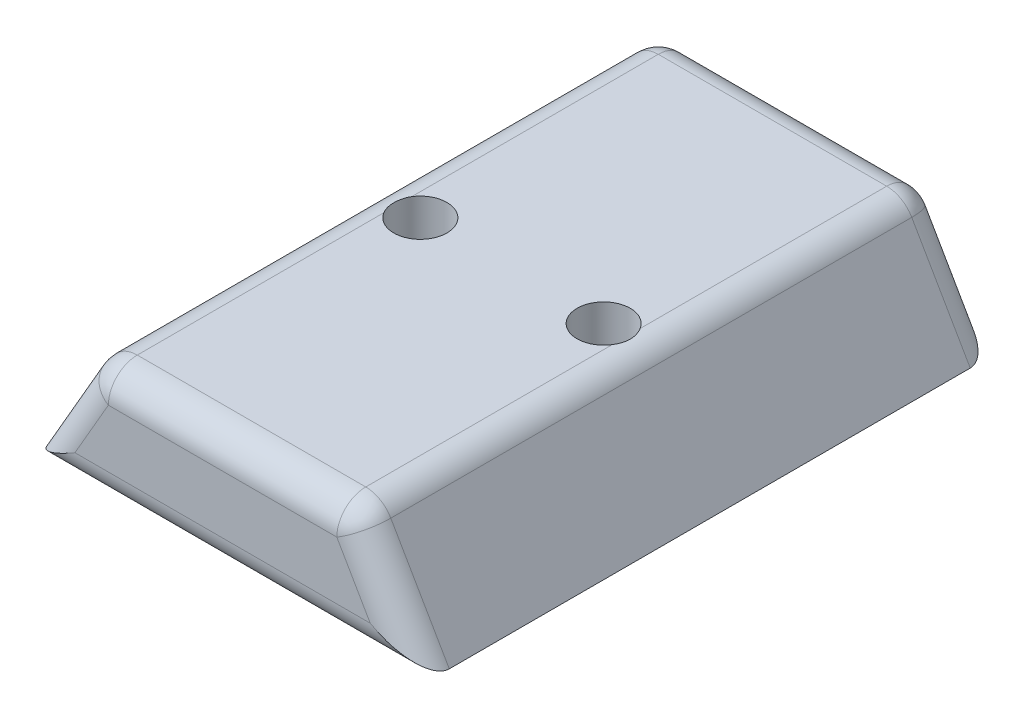
ISO-10303-21;
HEADER;
FILE_DESCRIPTION(('STEP AP214'),'2;1');
FILE_NAME('part.step','',(''),(''),'','','');
FILE_SCHEMA(('AUTOMOTIVE_DESIGN { 1 0 10303 214 1 1 1 1 }'));
ENDSEC;
DATA;
#1=APPLICATION_CONTEXT('core data for automotive mechanical design processes');
#2=APPLICATION_PROTOCOL_DEFINITION('international standard','automotive_design',2000,#1);
#3=PRODUCT_CONTEXT('',#1,'mechanical');
#4=PRODUCT('Part','Part','',(#3));
#5=PRODUCT_RELATED_PRODUCT_CATEGORY('part','',(#4));
#6=PRODUCT_DEFINITION_FORMATION('','',#4);
#7=PRODUCT_DEFINITION_CONTEXT('part definition',#1,'design');
#8=PRODUCT_DEFINITION('design','',#6,#7);
#9=PRODUCT_DEFINITION_SHAPE('','',#8);
#10=(LENGTH_UNIT() NAMED_UNIT(*) SI_UNIT(.MILLI.,.METRE.));
#11=(NAMED_UNIT(*) PLANE_ANGLE_UNIT() SI_UNIT($,.RADIAN.));
#12=(NAMED_UNIT(*) SI_UNIT($,.STERADIAN.) SOLID_ANGLE_UNIT());
#13=UNCERTAINTY_MEASURE_WITH_UNIT(LENGTH_MEASURE(1.E-05),#10,'distance_accuracy_value','');
#14=(GEOMETRIC_REPRESENTATION_CONTEXT(3) GLOBAL_UNCERTAINTY_ASSIGNED_CONTEXT((#13)) GLOBAL_UNIT_ASSIGNED_CONTEXT((#10,
#11,#12)) REPRESENTATION_CONTEXT('',''));
#15=CARTESIAN_POINT('',(0.,0.,0.));
#16=DIRECTION('',(0.,0.,1.));
#17=DIRECTION('',(1.,0.,0.));
#18=AXIS2_PLACEMENT_3D('',#15,#16,#17);
#19=CARTESIAN_POINT('',(-20.5,0.,60.));
#20=DIRECTION('',(0.,1.,0.));
#21=DIRECTION('',(0.,0.,1.));
#22=AXIS2_PLACEMENT_3D('',#19,#20,#21);
#23=PLANE('',#22);
#24=CARTESIAN_POINT('',(9.5,0.,30.));
#25=DIRECTION('',(0.,-1.,0.));
#26=DIRECTION('',(0.,0.,-1.));
#27=AXIS2_PLACEMENT_3D('',#24,#25,#26);
#28=CIRCLE('',#27,5.025);
#29=CARTESIAN_POINT('',(9.5,0.,24.975));
#30=VERTEX_POINT('',#29);
#31=EDGE_CURVE('E429',#30,#30,#28,.T.);
#32=ORIENTED_EDGE('',*,*,#31,.F.);
#33=EDGE_LOOP('',(#32));
#34=FACE_BOUND('',#33,.T.);
#35=CARTESIAN_POINT('',(-9.5,0.,30.));
#36=DIRECTION('',(0.,-1.,0.));
#37=DIRECTION('',(0.,0.,-1.));
#38=AXIS2_PLACEMENT_3D('',#35,#36,#37);
#39=CIRCLE('',#38,5.025);
#40=CARTESIAN_POINT('',(-9.5,0.,24.975));
#41=VERTEX_POINT('',#40);
#42=EDGE_CURVE('E165',#41,#41,#39,.T.);
#43=ORIENTED_EDGE('',*,*,#42,.F.);
#44=EDGE_LOOP('',(#43));
#45=FACE_BOUND('',#44,.T.);
#46=DIRECTION('',(0.,0.,-1.));
#47=VECTOR('',#46,1.);
#48=CARTESIAN_POINT('',(20.5,0.,60.));
#49=LINE('',#48,#47);
#50=CARTESIAN_POINT('',(20.5,0.,57.));
#51=VERTEX_POINT('',#50);
#52=CARTESIAN_POINT('',(20.5,0.,3.));
#53=VERTEX_POINT('',#52);
#54=EDGE_CURVE('E389',#51,#53,#49,.T.);
#55=ORIENTED_EDGE('',*,*,#54,.F.);
#56=DIRECTION('',(1.,0.,0.));
#57=VECTOR('',#56,1.);
#58=CARTESIAN_POINT('',(-20.5,0.,57.));
#59=LINE('',#58,#57);
#60=CARTESIAN_POINT('',(-20.5,0.,57.));
#61=VERTEX_POINT('',#60);
#62=EDGE_CURVE('E220',#51,#61,#59,.F.);
#63=ORIENTED_EDGE('',*,*,#62,.T.);
#64=DIRECTION('',(0.,0.,-1.));
#65=VECTOR('',#64,1.);
#66=CARTESIAN_POINT('',(-20.5,0.,60.));
#67=LINE('',#66,#65);
#68=CARTESIAN_POINT('',(-20.5,0.,3.));
#69=VERTEX_POINT('',#68);
#70=EDGE_CURVE('E290',#61,#69,#67,.T.);
#71=ORIENTED_EDGE('',*,*,#70,.T.);
#72=DIRECTION('',(1.,0.,0.));
#73=VECTOR('',#72,1.);
#74=CARTESIAN_POINT('',(-20.5,0.,3.));
#75=LINE('',#74,#73);
#76=EDGE_CURVE('E217',#69,#53,#75,.T.);
#77=ORIENTED_EDGE('',*,*,#76,.T.);
#78=EDGE_LOOP('',(#55,#63,#71,#77));
#79=FACE_BOUND('',#78,.T.);
#80=ADVANCED_FACE('F42',(#34,#45,#79),#23,.F.);
#81=CARTESIAN_POINT('',(20.5,0.,60.));
#82=DIRECTION('',(-0.86602540378444,-0.499999999999998,0.));
#83=DIRECTION('',(0.499999999999998,-0.86602540378444,0.));
#84=AXIS2_PLACEMENT_3D('',#81,#82,#83);
#85=PLANE('',#84);
#86=DIRECTION('',(0.,0.,-1.));
#87=VECTOR('',#86,1.);
#88=CARTESIAN_POINT('',(14.437822173509,10.5,60.));
#89=LINE('',#88,#87);
#90=CARTESIAN_POINT('',(14.437822173509,10.5,3.));
#91=VERTEX_POINT('',#90);
#92=CARTESIAN_POINT('',(14.437822173509,10.5,57.));
#93=VERTEX_POINT('',#92);
#94=EDGE_CURVE('E189',#91,#93,#89,.F.);
#95=ORIENTED_EDGE('',*,*,#94,.T.);
#96=DIRECTION('',(-0.499999999999998,0.86602540378444,0.));
#97=VECTOR('',#96,1.);
#98=CARTESIAN_POINT('',(20.5,0.,57.));
#99=LINE('',#98,#97);
#100=EDGE_CURVE('E193',#93,#51,#99,.F.);
#101=ORIENTED_EDGE('',*,*,#100,.T.);
#102=ORIENTED_EDGE('',*,*,#54,.T.);
#103=DIRECTION('',(-0.499999999999998,0.86602540378444,0.));
#104=VECTOR('',#103,1.);
#105=CARTESIAN_POINT('',(20.5,0.,3.));
#106=LINE('',#105,#104);
#107=EDGE_CURVE('E187',#53,#91,#106,.T.);
#108=ORIENTED_EDGE('',*,*,#107,.T.);
#109=EDGE_LOOP('',(#95,#101,#102,#108));
#110=FACE_BOUND('',#109,.T.);
#111=ADVANCED_FACE('F321',(#110),#85,.F.);
#112=CARTESIAN_POINT('',(-13.5717967697245,12.,60.));
#113=DIRECTION('',(0.,-1.,0.));
#114=DIRECTION('',(0.,0.,-1.));
#115=AXIS2_PLACEMENT_3D('',#112,#113,#114);
#116=PLANE('',#115);
#117=DIRECTION('',(0.,0.,-1.));
#118=VECTOR('',#117,1.);
#119=CARTESIAN_POINT('',(11.8397459621557,12.,60.));
#120=LINE('',#119,#118);
#121=CARTESIAN_POINT('',(11.8397459621557,12.,57.));
#122=VERTEX_POINT('',#121);
#123=CARTESIAN_POINT('',(11.8397459621557,12.,31.4450220872278));
#124=VERTEX_POINT('',#123);
#125=EDGE_CURVE('E163',#122,#124,#120,.T.);
#126=ORIENTED_EDGE('',*,*,#125,.T.);
#127=CARTESIAN_POINT('',(9.5,12.,30.));
#128=DIRECTION('',(0.,-1.,0.));
#129=DIRECTION('',(0.,0.,-1.));
#130=AXIS2_PLACEMENT_3D('',#127,#128,#129);
#131=CIRCLE('',#130,2.75);
#132=CARTESIAN_POINT('',(11.8397459621557,12.,28.5549779127722));
#133=VERTEX_POINT('',#132);
#134=EDGE_CURVE('E65',#124,#133,#131,.T.);
#135=ORIENTED_EDGE('',*,*,#134,.T.);
#136=CARTESIAN_POINT('',(11.8397459621557,12.,3.));
#137=VERTEX_POINT('',#136);
#138=EDGE_CURVE('E161',#133,#137,#120,.T.);
#139=ORIENTED_EDGE('',*,*,#138,.T.);
#140=DIRECTION('',(-1.,0.,0.));
#141=VECTOR('',#140,1.);
#142=CARTESIAN_POINT('',(-13.5717967697245,12.,3.));
#143=LINE('',#142,#141);
#144=CARTESIAN_POINT('',(-11.8397459621556,12.,3.));
#145=VERTEX_POINT('',#144);
#146=EDGE_CURVE('E395',#137,#145,#143,.T.);
#147=ORIENTED_EDGE('',*,*,#146,.T.);
#148=DIRECTION('',(0.,0.,-1.));
#149=VECTOR('',#148,1.);
#150=CARTESIAN_POINT('',(-11.8397459621556,12.,60.));
#151=LINE('',#150,#149);
#152=CARTESIAN_POINT('',(-11.8397459621556,12.,28.5549779127721));
#153=VERTEX_POINT('',#152);
#154=EDGE_CURVE('E174',#145,#153,#151,.F.);
#155=ORIENTED_EDGE('',*,*,#154,.T.);
#156=CARTESIAN_POINT('',(-9.5,12.,30.));
#157=DIRECTION('',(0.,-1.,0.));
#158=DIRECTION('',(0.,0.,-1.));
#159=AXIS2_PLACEMENT_3D('',#156,#157,#158);
#160=CIRCLE('',#159,2.75);
#161=CARTESIAN_POINT('',(-11.8397459621556,12.,31.4450220872278));
#162=VERTEX_POINT('',#161);
#163=EDGE_CURVE('E75',#153,#162,#160,.T.);
#164=ORIENTED_EDGE('',*,*,#163,.T.);
#165=CARTESIAN_POINT('',(-11.8397459621556,12.,57.));
#166=VERTEX_POINT('',#165);
#167=EDGE_CURVE('E181',#162,#166,#151,.F.);
#168=ORIENTED_EDGE('',*,*,#167,.T.);
#169=DIRECTION('',(-1.,0.,0.));
#170=VECTOR('',#169,1.);
#171=CARTESIAN_POINT('',(13.5717967697245,12.,57.));
#172=LINE('',#171,#170);
#173=EDGE_CURVE('E178',#166,#122,#172,.F.);
#174=ORIENTED_EDGE('',*,*,#173,.T.);
#175=EDGE_LOOP('',(#126,#135,#139,#147,#155,#164,#168,#174));
#176=FACE_BOUND('',#175,.T.);
#177=ADVANCED_FACE('F160',(#176),#116,.F.);
#178=CARTESIAN_POINT('',(-20.5,0.,60.));
#179=DIRECTION('',(0.86602540378444,-0.499999999999998,0.));
#180=DIRECTION('',(0.499999999999998,0.86602540378444,0.));
#181=AXIS2_PLACEMENT_3D('',#178,#179,#180);
#182=PLANE('',#181);
#183=ORIENTED_EDGE('',*,*,#70,.F.);
#184=DIRECTION('',(-0.499999999999998,-0.86602540378444,0.));
#185=VECTOR('',#184,1.);
#186=CARTESIAN_POINT('',(-13.5717967697245,12.,57.));
#187=LINE('',#186,#185);
#188=CARTESIAN_POINT('',(-14.437822173509,10.5,57.));
#189=VERTEX_POINT('',#188);
#190=EDGE_CURVE('E201',#61,#189,#187,.F.);
#191=ORIENTED_EDGE('',*,*,#190,.T.);
#192=DIRECTION('',(0.,0.,-1.));
#193=VECTOR('',#192,1.);
#194=CARTESIAN_POINT('',(-14.437822173509,10.5,60.));
#195=LINE('',#194,#193);
#196=CARTESIAN_POINT('',(-14.437822173509,10.5,3.));
#197=VERTEX_POINT('',#196);
#198=EDGE_CURVE('E198',#189,#197,#195,.T.);
#199=ORIENTED_EDGE('',*,*,#198,.T.);
#200=DIRECTION('',(-0.499999999999998,-0.86602540378444,0.));
#201=VECTOR('',#200,1.);
#202=CARTESIAN_POINT('',(-20.5,0.,3.));
#203=LINE('',#202,#201);
#204=EDGE_CURVE('E195',#197,#69,#203,.T.);
#205=ORIENTED_EDGE('',*,*,#204,.T.);
#206=EDGE_LOOP('',(#183,#191,#199,#205));
#207=FACE_BOUND('',#206,.T.);
#208=ADVANCED_FACE('F311',(#207),#182,.F.);
#209=CARTESIAN_POINT('',(0.,0.,60.));
#210=DIRECTION('',(0.,0.,1.));
#211=DIRECTION('',(1.,0.,0.));
#212=AXIS2_PLACEMENT_3D('',#209,#210,#211);
#213=PLANE('',#212);
#214=DIRECTION('',(-1.,0.,0.));
#215=VECTOR('',#214,1.);
#216=CARTESIAN_POINT('',(-13.5717967697245,9.,60.));
#217=LINE('',#216,#215);
#218=CARTESIAN_POINT('',(11.8397459621556,9.,60.));
#219=VERTEX_POINT('',#218);
#220=CARTESIAN_POINT('',(-11.8397459621556,9.,60.));
#221=VERTEX_POINT('',#220);
#222=EDGE_CURVE('E210',#219,#221,#217,.T.);
#223=ORIENTED_EDGE('',*,*,#222,.T.);
#224=DIRECTION('',(-0.499999999999998,-0.86602540378444,0.));
#225=VECTOR('',#224,1.);
#226=CARTESIAN_POINT('',(-17.9019237886467,-1.49999999999999,60.));
#227=LINE('',#226,#225);
#228=CARTESIAN_POINT('',(-15.3038475772934,3.,60.));
#229=VERTEX_POINT('',#228);
#230=EDGE_CURVE('E213',#221,#229,#227,.T.);
#231=ORIENTED_EDGE('',*,*,#230,.T.);
#232=DIRECTION('',(1.,0.,0.));
#233=VECTOR('',#232,1.);
#234=CARTESIAN_POINT('',(20.5,3.,60.));
#235=LINE('',#234,#233);
#236=CARTESIAN_POINT('',(15.3038475772934,3.,60.));
#237=VERTEX_POINT('',#236);
#238=EDGE_CURVE('E204',#229,#237,#235,.T.);
#239=ORIENTED_EDGE('',*,*,#238,.T.);
#240=DIRECTION('',(-0.499999999999998,0.86602540378444,0.));
#241=VECTOR('',#240,1.);
#242=CARTESIAN_POINT('',(10.9737205583712,10.5,60.));
#243=LINE('',#242,#241);
#244=EDGE_CURVE('E207',#237,#219,#243,.T.);
#245=ORIENTED_EDGE('',*,*,#244,.T.);
#246=EDGE_LOOP('',(#223,#231,#239,#245));
#247=FACE_BOUND('',#246,.T.);
#248=ADVANCED_FACE('F307',(#247),#213,.T.);
#249=CARTESIAN_POINT('',(0.,0.,0.));
#250=DIRECTION('',(0.,0.,1.));
#251=DIRECTION('',(1.,0.,0.));
#252=AXIS2_PLACEMENT_3D('',#249,#250,#251);
#253=PLANE('',#252);
#254=DIRECTION('',(1.,0.,0.));
#255=VECTOR('',#254,1.);
#256=CARTESIAN_POINT('',(0.,3.,0.));
#257=LINE('',#256,#255);
#258=CARTESIAN_POINT('',(15.3038475772934,3.,0.));
#259=VERTEX_POINT('',#258);
#260=CARTESIAN_POINT('',(-15.3038475772934,3.,0.));
#261=VERTEX_POINT('',#260);
#262=EDGE_CURVE('E223',#259,#261,#257,.F.);
#263=ORIENTED_EDGE('',*,*,#262,.T.);
#264=DIRECTION('',(-0.499999999999998,-0.86602540378444,0.));
#265=VECTOR('',#264,1.);
#266=CARTESIAN_POINT('',(-12.7769237886467,7.37676038879048,0.));
#267=LINE('',#266,#265);
#268=CARTESIAN_POINT('',(-11.8397459621556,9.,0.));
#269=VERTEX_POINT('',#268);
#270=EDGE_CURVE('E231',#261,#269,#267,.F.);
#271=ORIENTED_EDGE('',*,*,#270,.T.);
#272=DIRECTION('',(-1.,0.,0.));
#273=VECTOR('',#272,1.);
#274=CARTESIAN_POINT('',(0.,9.,0.));
#275=LINE('',#274,#273);
#276=CARTESIAN_POINT('',(11.8397459621556,9.,0.));
#277=VERTEX_POINT('',#276);
#278=EDGE_CURVE('E228',#269,#277,#275,.F.);
#279=ORIENTED_EDGE('',*,*,#278,.T.);
#280=DIRECTION('',(-0.499999999999998,0.86602540378444,0.));
#281=VECTOR('',#280,1.);
#282=CARTESIAN_POINT('',(12.7769237886467,7.37676038879048,0.));
#283=LINE('',#282,#281);
#284=EDGE_CURVE('E226',#277,#259,#283,.F.);
#285=ORIENTED_EDGE('',*,*,#284,.T.);
#286=EDGE_LOOP('',(#263,#271,#279,#285));
#287=FACE_BOUND('',#286,.T.);
#288=ADVANCED_FACE('F310',(#287),#253,.F.);
#289=CARTESIAN_POINT('',(-12.7769237886467,7.37676038879048,57.));
#290=DIRECTION('',(0.499999999999998,0.86602540378444,0.));
#291=DIRECTION('',(-0.86602540378444,0.499999999999998,0.));
#292=AXIS2_PLACEMENT_3D('',#289,#290,#291);
#293=CYLINDRICAL_SURFACE('',#292,3.);
#294=CARTESIAN_POINT('',(-11.8397459621557,9.,57.));
#295=DIRECTION('',(0.499999999999998,0.86602540378444,0.));
#296=DIRECTION('',(-0.86602540378444,0.499999999999998,0.));
#297=AXIS2_PLACEMENT_3D('',#294,#295,#296);
#298=CIRCLE('',#297,3.);
#299=EDGE_CURVE('E283',#189,#221,#298,.T.);
#300=ORIENTED_EDGE('',*,*,#299,.F.);
#301=ORIENTED_EDGE('',*,*,#190,.F.);
#302=CARTESIAN_POINT('',(-15.3038475772934,3.,57.));
#303=DIRECTION('',(-0.500000000000001,0.866025403784438,0.));
#304=DIRECTION('',(-0.866025403784438,-0.500000000000001,0.));
#305=AXIS2_PLACEMENT_3D('',#302,#303,#304);
#306=ELLIPSE('',#305,5.99999999999999,3.);
#307=EDGE_CURVE('E287',#229,#61,#306,.F.);
#308=ORIENTED_EDGE('',*,*,#307,.F.);
#309=ORIENTED_EDGE('',*,*,#230,.F.);
#310=EDGE_LOOP('',(#300,#301,#308,#309));
#311=FACE_BOUND('',#310,.T.);
#312=ADVANCED_FACE('F44',(#311),#293,.T.);
#313=CARTESIAN_POINT('',(-11.8397459621556,9.,60.));
#314=DIRECTION('',(0.,0.,-1.));
#315=DIRECTION('',(-1.,0.,0.));
#316=AXIS2_PLACEMENT_3D('',#313,#314,#315);
#317=CYLINDRICAL_SURFACE('',#316,3.);
#318=CARTESIAN_POINT('',(-11.8397459621556,12.,28.5549779127721));
#319=CARTESIAN_POINT('',(-11.8803246670771,11.9999881830058,28.6206682755428));
#320=CARTESIAN_POINT('',(-11.9181174114233,11.9991763051452,28.6880637076477));
#321=CARTESIAN_POINT('',(-11.9878957790229,11.9965461801406,28.8257676379646));
#322=CARTESIAN_POINT('',(-12.0198822061214,11.9947280724436,28.8960757312805));
#323=CARTESIAN_POINT('',(-12.0778053779559,11.9906802171333,29.0390801347593));
#324=CARTESIAN_POINT('',(-12.103746021153,11.9884507364542,29.1117748712607));
#325=CARTESIAN_POINT('',(-12.1494288422993,11.9840602838275,29.2590677225592));
#326=CARTESIAN_POINT('',(-12.1691709783086,11.9818993123436,29.3336658502312));
#327=CARTESIAN_POINT('',(-12.2188762959551,11.9761452591737,29.5596104560013));
#328=CARTESIAN_POINT('',(-12.2393508339789,11.9732778348123,29.7131874546842));
#329=CARTESIAN_POINT('',(-12.254249041289,11.9712346131611,30.0215571765195));
#330=CARTESIAN_POINT('',(-12.248672591544,11.9720588327389,30.1763499052235));
#331=CARTESIAN_POINT('',(-12.2117812701018,11.9768989353313,30.4820147815277));
#332=CARTESIAN_POINT('',(-12.1805888339205,11.9808996328733,30.6329020643346));
#333=CARTESIAN_POINT('',(-12.0934974993031,11.9895658050775,30.9272304604111));
#334=CARTESIAN_POINT('',(-12.0376335649203,11.9942303326524,31.0706817914675));
#335=CARTESIAN_POINT('',(-11.9504872484178,11.9980193651458,31.248862951115));
#336=CARTESIAN_POINT('',(-11.9296735387187,11.9987305683929,31.288885736014));
#337=CARTESIAN_POINT('',(-11.8861360335124,11.9997206901444,31.3677998284415));
#338=CARTESIAN_POINT('',(-11.8634153663254,12.0000003025946,31.4066928534647));
#339=CARTESIAN_POINT('',(-11.8397459621556,12.,31.4450220872279));
#340=B_SPLINE_CURVE_WITH_KNOTS('',3,(#318,#319,#320,#321,#322,#323,#324,#325,#326,#327,#328,
#329,#330,#331,#332,#333,#334,#335,#336,#337,#338,#339),.UNSPECIFIED.,.F.,.F.,(4,2,2,2,2,2,2,2,
2,2,4),(0.,0.231546709430845,0.46306133830025,0.694426265586903,0.925792758288918,
1.38826901469036,1.85074738422303,2.31102804560355,2.77065848738277,2.90597061661656,
3.04106495281453),.UNSPECIFIED.);
#341=EDGE_CURVE('E57',#153,#162,#340,.T.);
#342=ORIENTED_EDGE('',*,*,#341,.F.);
#343=ORIENTED_EDGE('',*,*,#154,.F.);
#344=CARTESIAN_POINT('',(-11.8397459621557,9.,3.));
#345=DIRECTION('',(0.,0.,-1.));
#346=DIRECTION('',(-1.,0.,0.));
#347=AXIS2_PLACEMENT_3D('',#344,#345,#346);
#348=CIRCLE('',#347,3.);
#349=EDGE_CURVE('E275',#197,#145,#348,.T.);
#350=ORIENTED_EDGE('',*,*,#349,.F.);
#351=ORIENTED_EDGE('',*,*,#198,.F.);
#352=CARTESIAN_POINT('',(-11.8397459621556,9.,57.));
#353=DIRECTION('',(0.,0.,1.));
#354=DIRECTION('',(1.,0.,0.));
#355=AXIS2_PLACEMENT_3D('',#352,#353,#354);
#356=CIRCLE('',#355,3.);
#357=EDGE_CURVE('E279',#166,#189,#356,.T.);
#358=ORIENTED_EDGE('',*,*,#357,.F.);
#359=ORIENTED_EDGE('',*,*,#167,.F.);
#360=EDGE_LOOP('',(#342,#343,#350,#351,#358,#359));
#361=FACE_BOUND('',#360,.T.);
#362=ADVANCED_FACE('F297',(#361),#317,.T.);
#363=CARTESIAN_POINT('',(-17.9019237886467,-1.49999999999999,3.));
#364=DIRECTION('',(-0.499999999999998,-0.86602540378444,0.));
#365=DIRECTION('',(0.86602540378444,-0.499999999999998,0.));
#366=AXIS2_PLACEMENT_3D('',#363,#364,#365);
#367=CYLINDRICAL_SURFACE('',#366,3.);
#368=CARTESIAN_POINT('',(-15.3038475772934,3.,3.));
#369=DIRECTION('',(0.500000000000001,-0.866025403784438,0.));
#370=DIRECTION('',(0.866025403784438,0.500000000000001,0.));
#371=AXIS2_PLACEMENT_3D('',#368,#369,#370);
#372=ELLIPSE('',#371,5.99999999999999,3.);
#373=EDGE_CURVE('E267',#69,#261,#372,.T.);
#374=ORIENTED_EDGE('',*,*,#373,.F.);
#375=ORIENTED_EDGE('',*,*,#204,.F.);
#376=CARTESIAN_POINT('',(-11.8397459621556,9.,3.));
#377=DIRECTION('',(0.499999999999998,0.86602540378444,0.));
#378=DIRECTION('',(-0.86602540378444,0.499999999999998,0.));
#379=AXIS2_PLACEMENT_3D('',#376,#377,#378);
#380=CIRCLE('',#379,3.);
#381=EDGE_CURVE('E271',#269,#197,#380,.T.);
#382=ORIENTED_EDGE('',*,*,#381,.F.);
#383=ORIENTED_EDGE('',*,*,#270,.F.);
#384=EDGE_LOOP('',(#374,#375,#382,#383));
#385=FACE_BOUND('',#384,.T.);
#386=ADVANCED_FACE('F368',(#385),#367,.T.);
#387=CARTESIAN_POINT('',(0.,3.,57.));
#388=DIRECTION('',(-1.,0.,0.));
#389=DIRECTION('',(0.,0.,1.));
#390=AXIS2_PLACEMENT_3D('',#387,#388,#389);
#391=CYLINDRICAL_SURFACE('',#390,3.);
#392=ORIENTED_EDGE('',*,*,#307,.T.);
#393=ORIENTED_EDGE('',*,*,#62,.F.);
#394=CARTESIAN_POINT('',(15.3038475772934,3.,57.));
#395=DIRECTION('',(-0.500000000000001,-0.866025403784438,0.));
#396=DIRECTION('',(-0.866025403784438,0.500000000000001,0.));
#397=AXIS2_PLACEMENT_3D('',#394,#395,#396);
#398=ELLIPSE('',#397,5.99999999999999,3.);
#399=EDGE_CURVE('E263',#237,#51,#398,.F.);
#400=ORIENTED_EDGE('',*,*,#399,.F.);
#401=ORIENTED_EDGE('',*,*,#238,.F.);
#402=EDGE_LOOP('',(#392,#393,#400,#401));
#403=FACE_BOUND('',#402,.T.);
#404=ADVANCED_FACE('F365',(#403),#391,.T.);
#405=CARTESIAN_POINT('',(-11.8397459621556,9.,57.));
#406=DIRECTION('',(0.,0.,1.));
#407=DIRECTION('',(1.,0.,0.));
#408=AXIS2_PLACEMENT_3D('',#405,#406,#407);
#409=SPHERICAL_SURFACE('',#408,3.);
#410=ORIENTED_EDGE('',*,*,#357,.T.);
#411=ORIENTED_EDGE('',*,*,#299,.T.);
#412=CARTESIAN_POINT('',(-11.8397459621556,9.,57.));
#413=DIRECTION('',(-1.,0.,0.));
#414=DIRECTION('',(0.,-1.,0.));
#415=AXIS2_PLACEMENT_3D('',#412,#413,#414);
#416=CIRCLE('',#415,3.);
#417=EDGE_CURVE('E259',#166,#221,#416,.F.);
#418=ORIENTED_EDGE('',*,*,#417,.F.);
#419=EDGE_LOOP('',(#410,#411,#418));
#420=FACE_BOUND('',#419,.T.);
#421=ADVANCED_FACE('F361',(#420),#409,.T.);
#422=CARTESIAN_POINT('',(-11.8397459621556,9.,3.));
#423=DIRECTION('',(0.,0.,-1.));
#424=DIRECTION('',(-1.,0.,0.));
#425=AXIS2_PLACEMENT_3D('',#422,#423,#424);
#426=SPHERICAL_SURFACE('',#425,3.);
#427=ORIENTED_EDGE('',*,*,#381,.T.);
#428=ORIENTED_EDGE('',*,*,#349,.T.);
#429=CARTESIAN_POINT('',(-11.8397459621556,9.,3.));
#430=DIRECTION('',(-1.,0.,0.));
#431=DIRECTION('',(0.,0.,1.));
#432=AXIS2_PLACEMENT_3D('',#429,#430,#431);
#433=CIRCLE('',#432,3.);
#434=EDGE_CURVE('E255',#269,#145,#433,.F.);
#435=ORIENTED_EDGE('',*,*,#434,.F.);
#436=EDGE_LOOP('',(#427,#428,#435));
#437=FACE_BOUND('',#436,.T.);
#438=ADVANCED_FACE('F357',(#437),#426,.T.);
#439=CARTESIAN_POINT('',(-20.5,3.,3.));
#440=DIRECTION('',(1.,0.,0.));
#441=DIRECTION('',(0.,0.,-1.));
#442=AXIS2_PLACEMENT_3D('',#439,#440,#441);
#443=CYLINDRICAL_SURFACE('',#442,3.);
#444=ORIENTED_EDGE('',*,*,#373,.T.);
#445=ORIENTED_EDGE('',*,*,#262,.F.);
#446=CARTESIAN_POINT('',(15.3038475772934,3.,3.));
#447=DIRECTION('',(0.500000000000001,0.866025403784438,0.));
#448=DIRECTION('',(0.866025403784438,-0.500000000000001,0.));
#449=AXIS2_PLACEMENT_3D('',#446,#447,#448);
#450=ELLIPSE('',#449,5.99999999999999,3.);
#451=EDGE_CURVE('E252',#53,#259,#450,.T.);
#452=ORIENTED_EDGE('',*,*,#451,.F.);
#453=ORIENTED_EDGE('',*,*,#76,.F.);
#454=EDGE_LOOP('',(#444,#445,#452,#453));
#455=FACE_BOUND('',#454,.T.);
#456=ADVANCED_FACE('F353',(#455),#443,.T.);
#457=CARTESIAN_POINT('',(12.7769237886467,7.37676038879048,57.));
#458=DIRECTION('',(0.499999999999998,-0.86602540378444,0.));
#459=DIRECTION('',(0.86602540378444,0.499999999999998,0.));
#460=AXIS2_PLACEMENT_3D('',#457,#458,#459);
#461=CYLINDRICAL_SURFACE('',#460,3.);
#462=ORIENTED_EDGE('',*,*,#399,.T.);
#463=ORIENTED_EDGE('',*,*,#100,.F.);
#464=CARTESIAN_POINT('',(11.8397459621556,9.,57.));
#465=DIRECTION('',(-0.499999999999997,0.86602540378444,0.));
#466=DIRECTION('',(-0.86602540378444,-0.499999999999997,0.));
#467=AXIS2_PLACEMENT_3D('',#464,#465,#466);
#468=CIRCLE('',#467,3.);
#469=EDGE_CURVE('E248',#219,#93,#468,.T.);
#470=ORIENTED_EDGE('',*,*,#469,.F.);
#471=ORIENTED_EDGE('',*,*,#244,.F.);
#472=EDGE_LOOP('',(#462,#463,#470,#471));
#473=FACE_BOUND('',#472,.T.);
#474=ADVANCED_FACE('F349',(#473),#461,.T.);
#475=CARTESIAN_POINT('',(0.,9.,57.));
#476=DIRECTION('',(1.,0.,0.));
#477=DIRECTION('',(0.,0.,-1.));
#478=AXIS2_PLACEMENT_3D('',#475,#476,#477);
#479=CYLINDRICAL_SURFACE('',#478,3.);
#480=ORIENTED_EDGE('',*,*,#417,.T.);
#481=ORIENTED_EDGE('',*,*,#222,.F.);
#482=CARTESIAN_POINT('',(11.8397459621557,9.,57.));
#483=DIRECTION('',(1.,0.,0.));
#484=DIRECTION('',(0.,0.,-1.));
#485=AXIS2_PLACEMENT_3D('',#482,#483,#484);
#486=CIRCLE('',#485,3.);
#487=EDGE_CURVE('E244',#122,#219,#486,.T.);
#488=ORIENTED_EDGE('',*,*,#487,.F.);
#489=ORIENTED_EDGE('',*,*,#173,.F.);
#490=EDGE_LOOP('',(#480,#481,#488,#489));
#491=FACE_BOUND('',#490,.T.);
#492=ADVANCED_FACE('F345',(#491),#479,.T.);
#493=CARTESIAN_POINT('',(-13.5717967697245,9.,3.));
#494=DIRECTION('',(-1.,0.,0.));
#495=DIRECTION('',(0.,0.,1.));
#496=AXIS2_PLACEMENT_3D('',#493,#494,#495);
#497=CYLINDRICAL_SURFACE('',#496,3.);
#498=ORIENTED_EDGE('',*,*,#434,.T.);
#499=ORIENTED_EDGE('',*,*,#146,.F.);
#500=CARTESIAN_POINT('',(11.8397459621556,9.,3.));
#501=DIRECTION('',(1.,0.,0.));
#502=DIRECTION('',(0.,1.,0.));
#503=AXIS2_PLACEMENT_3D('',#500,#501,#502);
#504=CIRCLE('',#503,3.);
#505=EDGE_CURVE('E242',#277,#137,#504,.T.);
#506=ORIENTED_EDGE('',*,*,#505,.F.);
#507=ORIENTED_EDGE('',*,*,#278,.F.);
#508=EDGE_LOOP('',(#498,#499,#506,#507));
#509=FACE_BOUND('',#508,.T.);
#510=ADVANCED_FACE('F341',(#509),#497,.T.);
#511=CARTESIAN_POINT('',(17.9019237886467,-1.49999999999999,3.));
#512=DIRECTION('',(-0.499999999999998,0.86602540378444,0.));
#513=DIRECTION('',(-0.86602540378444,-0.499999999999998,0.));
#514=AXIS2_PLACEMENT_3D('',#511,#512,#513);
#515=CYLINDRICAL_SURFACE('',#514,3.);
#516=ORIENTED_EDGE('',*,*,#451,.T.);
#517=ORIENTED_EDGE('',*,*,#284,.F.);
#518=CARTESIAN_POINT('',(11.8397459621557,9.,3.));
#519=DIRECTION('',(-0.499999999999998,0.86602540378444,0.));
#520=DIRECTION('',(-0.86602540378444,-0.499999999999998,0.));
#521=AXIS2_PLACEMENT_3D('',#518,#519,#520);
#522=CIRCLE('',#521,3.);
#523=EDGE_CURVE('E239',#91,#277,#522,.T.);
#524=ORIENTED_EDGE('',*,*,#523,.F.);
#525=ORIENTED_EDGE('',*,*,#107,.F.);
#526=EDGE_LOOP('',(#516,#517,#524,#525));
#527=FACE_BOUND('',#526,.T.);
#528=ADVANCED_FACE('F337',(#527),#515,.T.);
#529=CARTESIAN_POINT('',(11.8397459621556,9.,57.));
#530=DIRECTION('',(0.,0.,1.));
#531=DIRECTION('',(1.,0.,0.));
#532=AXIS2_PLACEMENT_3D('',#529,#530,#531);
#533=SPHERICAL_SURFACE('',#532,3.);
#534=ORIENTED_EDGE('',*,*,#487,.T.);
#535=ORIENTED_EDGE('',*,*,#469,.T.);
#536=CARTESIAN_POINT('',(11.8397459621557,9.,57.));
#537=DIRECTION('',(0.,0.,1.));
#538=DIRECTION('',(1.,0.,0.));
#539=AXIS2_PLACEMENT_3D('',#536,#537,#538);
#540=CIRCLE('',#539,3.);
#541=EDGE_CURVE('E236',#122,#93,#540,.F.);
#542=ORIENTED_EDGE('',*,*,#541,.F.);
#543=EDGE_LOOP('',(#534,#535,#542));
#544=FACE_BOUND('',#543,.T.);
#545=ADVANCED_FACE('F333',(#544),#533,.T.);
#546=CARTESIAN_POINT('',(11.8397459621556,9.,3.));
#547=DIRECTION('',(0.,0.,-1.));
#548=DIRECTION('',(-1.,0.,0.));
#549=AXIS2_PLACEMENT_3D('',#546,#547,#548);
#550=SPHERICAL_SURFACE('',#549,3.);
#551=ORIENTED_EDGE('',*,*,#523,.T.);
#552=ORIENTED_EDGE('',*,*,#505,.T.);
#553=CARTESIAN_POINT('',(11.8397459621557,9.,3.));
#554=DIRECTION('',(0.,0.,-1.));
#555=DIRECTION('',(-1.,0.,0.));
#556=AXIS2_PLACEMENT_3D('',#553,#554,#555);
#557=CIRCLE('',#556,3.);
#558=EDGE_CURVE('E171',#91,#137,#557,.F.);
#559=ORIENTED_EDGE('',*,*,#558,.F.);
#560=EDGE_LOOP('',(#551,#552,#559));
#561=FACE_BOUND('',#560,.T.);
#562=ADVANCED_FACE('F330',(#561),#550,.T.);
#563=CARTESIAN_POINT('',(11.8397459621557,9.,60.));
#564=DIRECTION('',(0.,0.,-1.));
#565=DIRECTION('',(-1.,0.,0.));
#566=AXIS2_PLACEMENT_3D('',#563,#564,#565);
#567=CYLINDRICAL_SURFACE('',#566,3.);
#568=CARTESIAN_POINT('',(11.8397459621557,12.,31.4450220872278));
#569=CARTESIAN_POINT('',(11.8803246670771,11.9999881830058,31.3793317244572));
#570=CARTESIAN_POINT('',(11.9181174114233,11.9991763051452,31.3119362923523));
#571=CARTESIAN_POINT('',(11.9878957790229,11.9965461801406,31.1742323620354));
#572=CARTESIAN_POINT('',(12.0198822061214,11.9947280724436,31.1039242687195));
#573=CARTESIAN_POINT('',(12.0778053779559,11.9906802171333,30.9609198652407));
#574=CARTESIAN_POINT('',(12.103746021153,11.9884507364542,30.8882251287393));
#575=CARTESIAN_POINT('',(12.1494288422993,11.9840602838275,30.7409322774408));
#576=CARTESIAN_POINT('',(12.1691709783086,11.9818993123436,30.6663341497688));
#577=CARTESIAN_POINT('',(12.2188762959551,11.9761452591737,30.4403895439987));
#578=CARTESIAN_POINT('',(12.2393508339789,11.9732778348123,30.2868125453158));
#579=CARTESIAN_POINT('',(12.254249041289,11.9712346131611,29.9784428234805));
#580=CARTESIAN_POINT('',(12.248672591544,11.9720588327389,29.8236500947765));
#581=CARTESIAN_POINT('',(12.2117812701018,11.9768989353313,29.5179852184723));
#582=CARTESIAN_POINT('',(12.1805888339205,11.9808996328733,29.3670979356654));
#583=CARTESIAN_POINT('',(12.0934974993031,11.9895658050775,29.0727695395889));
#584=CARTESIAN_POINT('',(12.0376335649203,11.9942303326524,28.9293182085325));
#585=CARTESIAN_POINT('',(11.9504872484178,11.9980193651458,28.751137048885));
#586=CARTESIAN_POINT('',(11.9296735387187,11.9987305683929,28.711114263986));
#587=CARTESIAN_POINT('',(11.8861360335124,11.9997206901444,28.6322001715585));
#588=CARTESIAN_POINT('',(11.8634153663254,12.0000003025946,28.5933071465353));
#589=CARTESIAN_POINT('',(11.8397459621557,12.,28.5549779127722));
#590=B_SPLINE_CURVE_WITH_KNOTS('',3,(#568,#569,#570,#571,#572,#573,#574,#575,#576,#577,#578,
#579,#580,#581,#582,#583,#584,#585,#586,#587,#588,#589),.UNSPECIFIED.,.F.,.F.,(4,2,2,2,2,2,2,2,
2,2,4),(0.,0.231546709430843,0.463061338300246,0.694426265586899,0.925792758288914,
1.38826901469036,1.85074738422302,2.31102804560355,2.77065848738276,2.90597061661655,
3.04106495281452),.UNSPECIFIED.);
#591=EDGE_CURVE('E11',#124,#133,#590,.T.);
#592=ORIENTED_EDGE('',*,*,#591,.F.);
#593=ORIENTED_EDGE('',*,*,#125,.F.);
#594=ORIENTED_EDGE('',*,*,#541,.T.);
#595=ORIENTED_EDGE('',*,*,#94,.F.);
#596=ORIENTED_EDGE('',*,*,#558,.T.);
#597=ORIENTED_EDGE('',*,*,#138,.F.);
#598=EDGE_LOOP('',(#592,#593,#594,#595,#596,#597));
#599=FACE_BOUND('',#598,.T.);
#600=ADVANCED_FACE('F168',(#599),#567,.T.);
#601=CARTESIAN_POINT('',(-9.5,0.,30.));
#602=DIRECTION('',(0.,-1.,0.));
#603=DIRECTION('',(0.,0.,-1.));
#604=AXIS2_PLACEMENT_3D('',#601,#602,#603);
#605=CYLINDRICAL_SURFACE('',#604,2.75);
#606=ORIENTED_EDGE('',*,*,#341,.T.);
#607=ORIENTED_EDGE('',*,*,#163,.F.);
#608=EDGE_LOOP('',(#606,#607));
#609=FACE_BOUND('',#608,.T.);
#610=CARTESIAN_POINT('',(-9.5,5.4,30.));
#611=DIRECTION('',(0.,-1.,0.));
#612=DIRECTION('',(0.,0.,-1.));
#613=AXIS2_PLACEMENT_3D('',#610,#611,#612);
#614=CIRCLE('',#613,2.75);
#615=CARTESIAN_POINT('',(-9.5,5.4,27.25));
#616=VERTEX_POINT('',#615);
#617=EDGE_CURVE('E403',#616,#616,#614,.T.);
#618=ORIENTED_EDGE('',*,*,#617,.T.);
#619=EDGE_LOOP('',(#618));
#620=FACE_BOUND('',#619,.T.);
#621=ADVANCED_FACE('F300',(#609,#620),#605,.F.);
#622=CARTESIAN_POINT('',(-4.5,5.4,30.));
#623=DIRECTION('',(0.,1.,0.));
#624=DIRECTION('',(0.,0.,1.));
#625=AXIS2_PLACEMENT_3D('',#622,#623,#624);
#626=PLANE('',#625);
#627=ORIENTED_EDGE('',*,*,#617,.F.);
#628=EDGE_LOOP('',(#627));
#629=FACE_BOUND('',#628,.T.);
#630=CARTESIAN_POINT('',(-9.5,5.4,30.));
#631=DIRECTION('',(0.,-1.,0.));
#632=DIRECTION('',(0.,0.,-1.));
#633=AXIS2_PLACEMENT_3D('',#630,#631,#632);
#634=CIRCLE('',#633,5.);
#635=CARTESIAN_POINT('',(-9.5,5.4,25.));
#636=VERTEX_POINT('',#635);
#637=EDGE_CURVE('E407',#636,#636,#634,.T.);
#638=ORIENTED_EDGE('',*,*,#637,.T.);
#639=EDGE_LOOP('',(#638));
#640=FACE_BOUND('',#639,.T.);
#641=ADVANCED_FACE('F305',(#629,#640),#626,.F.);
#642=CARTESIAN_POINT('',(-9.5,0.,30.));
#643=DIRECTION('',(0.,-1.,0.));
#644=DIRECTION('',(0.,0.,-1.));
#645=AXIS2_PLACEMENT_3D('',#642,#643,#644);
#646=CYLINDRICAL_SURFACE('',#645,5.);
#647=ORIENTED_EDGE('',*,*,#637,.F.);
#648=EDGE_LOOP('',(#647));
#649=FACE_BOUND('',#648,.T.);
#650=CARTESIAN_POINT('',(-9.5,0.0250000000000032,30.));
#651=DIRECTION('',(0.,-1.,0.));
#652=DIRECTION('',(0.,0.,-1.));
#653=AXIS2_PLACEMENT_3D('',#650,#651,#652);
#654=CIRCLE('',#653,5.);
#655=CARTESIAN_POINT('',(-9.5,0.0250000000000032,25.));
#656=VERTEX_POINT('',#655);
#657=EDGE_CURVE('E411',#656,#656,#654,.T.);
#658=ORIENTED_EDGE('',*,*,#657,.T.);
#659=EDGE_LOOP('',(#658));
#660=FACE_BOUND('',#659,.T.);
#661=ADVANCED_FACE('F440',(#649,#660),#646,.F.);
#662=CARTESIAN_POINT('',(-9.5,0.,30.));
#663=DIRECTION('',(0.,-1.,0.));
#664=DIRECTION('',(0.,0.,-1.));
#665=AXIS2_PLACEMENT_3D('',#662,#663,#664);
#666=CONICAL_SURFACE('',#665,5.025,0.78539816339745);
#667=ORIENTED_EDGE('',*,*,#657,.F.);
#668=EDGE_LOOP('',(#667));
#669=FACE_BOUND('',#668,.T.);
#670=ORIENTED_EDGE('',*,*,#42,.T.);
#671=EDGE_LOOP('',(#670));
#672=FACE_BOUND('',#671,.T.);
#673=ADVANCED_FACE('F438',(#669,#672),#666,.F.);
#674=CARTESIAN_POINT('',(9.5,0.,30.));
#675=DIRECTION('',(0.,-1.,0.));
#676=DIRECTION('',(0.,0.,-1.));
#677=AXIS2_PLACEMENT_3D('',#674,#675,#676);
#678=CYLINDRICAL_SURFACE('',#677,2.75);
#679=ORIENTED_EDGE('',*,*,#591,.T.);
#680=ORIENTED_EDGE('',*,*,#134,.F.);
#681=EDGE_LOOP('',(#679,#680));
#682=FACE_BOUND('',#681,.T.);
#683=CARTESIAN_POINT('',(9.5,5.4,30.));
#684=DIRECTION('',(0.,-1.,0.));
#685=DIRECTION('',(0.,0.,-1.));
#686=AXIS2_PLACEMENT_3D('',#683,#684,#685);
#687=CIRCLE('',#686,2.75);
#688=CARTESIAN_POINT('',(9.5,5.4,27.25));
#689=VERTEX_POINT('',#688);
#690=EDGE_CURVE('E166',#689,#689,#687,.T.);
#691=ORIENTED_EDGE('',*,*,#690,.T.);
#692=EDGE_LOOP('',(#691));
#693=FACE_BOUND('',#692,.T.);
#694=ADVANCED_FACE('F153',(#682,#693),#678,.F.);
#695=CARTESIAN_POINT('',(14.5,5.4,30.));
#696=DIRECTION('',(0.,1.,0.));
#697=DIRECTION('',(0.,0.,1.));
#698=AXIS2_PLACEMENT_3D('',#695,#696,#697);
#699=PLANE('',#698);
#700=ORIENTED_EDGE('',*,*,#690,.F.);
#701=EDGE_LOOP('',(#700));
#702=FACE_BOUND('',#701,.T.);
#703=CARTESIAN_POINT('',(9.5,5.4,30.));
#704=DIRECTION('',(0.,-1.,0.));
#705=DIRECTION('',(0.,0.,-1.));
#706=AXIS2_PLACEMENT_3D('',#703,#704,#705);
#707=CIRCLE('',#706,5.);
#708=CARTESIAN_POINT('',(9.5,5.4,25.));
#709=VERTEX_POINT('',#708);
#710=EDGE_CURVE('E421',#709,#709,#707,.T.);
#711=ORIENTED_EDGE('',*,*,#710,.T.);
#712=EDGE_LOOP('',(#711));
#713=FACE_BOUND('',#712,.T.);
#714=ADVANCED_FACE('F447',(#702,#713),#699,.F.);
#715=CARTESIAN_POINT('',(9.5,0.,30.));
#716=DIRECTION('',(0.,-1.,0.));
#717=DIRECTION('',(0.,0.,-1.));
#718=AXIS2_PLACEMENT_3D('',#715,#716,#717);
#719=CYLINDRICAL_SURFACE('',#718,5.);
#720=ORIENTED_EDGE('',*,*,#710,.F.);
#721=EDGE_LOOP('',(#720));
#722=FACE_BOUND('',#721,.T.);
#723=CARTESIAN_POINT('',(9.5,0.0250000000000032,30.));
#724=DIRECTION('',(0.,-1.,0.));
#725=DIRECTION('',(0.,0.,-1.));
#726=AXIS2_PLACEMENT_3D('',#723,#724,#725);
#727=CIRCLE('',#726,5.);
#728=CARTESIAN_POINT('',(9.5,0.0250000000000032,25.));
#729=VERTEX_POINT('',#728);
#730=EDGE_CURVE('E425',#729,#729,#727,.T.);
#731=ORIENTED_EDGE('',*,*,#730,.T.);
#732=EDGE_LOOP('',(#731));
#733=FACE_BOUND('',#732,.T.);
#734=ADVANCED_FACE('F454',(#722,#733),#719,.F.);
#735=CARTESIAN_POINT('',(9.5,0.,30.));
#736=DIRECTION('',(0.,-1.,0.));
#737=DIRECTION('',(0.,0.,-1.));
#738=AXIS2_PLACEMENT_3D('',#735,#736,#737);
#739=CONICAL_SURFACE('',#738,5.025,0.785398163397468);
#740=ORIENTED_EDGE('',*,*,#730,.F.);
#741=EDGE_LOOP('',(#740));
#742=FACE_BOUND('',#741,.T.);
#743=ORIENTED_EDGE('',*,*,#31,.T.);
#744=EDGE_LOOP('',(#743));
#745=FACE_BOUND('',#744,.T.);
#746=ADVANCED_FACE('F434',(#742,#745),#739,.F.);
#747=CLOSED_SHELL('',(#80,#111,#177,#208,#248,#288,#312,#362,#386,#404,#421,#438,#456,#474,#492,
#510,#528,#545,#562,#600,#621,#641,#661,#673,#694,#714,#734,#746));
#748=MANIFOLD_SOLID_BREP('B2',#747);
#749=ADVANCED_BREP_SHAPE_REPRESENTATION('',(#18,#748),#14);
#750=SHAPE_DEFINITION_REPRESENTATION(#9,#749);
ENDSEC;
END-ISO-10303-21;
